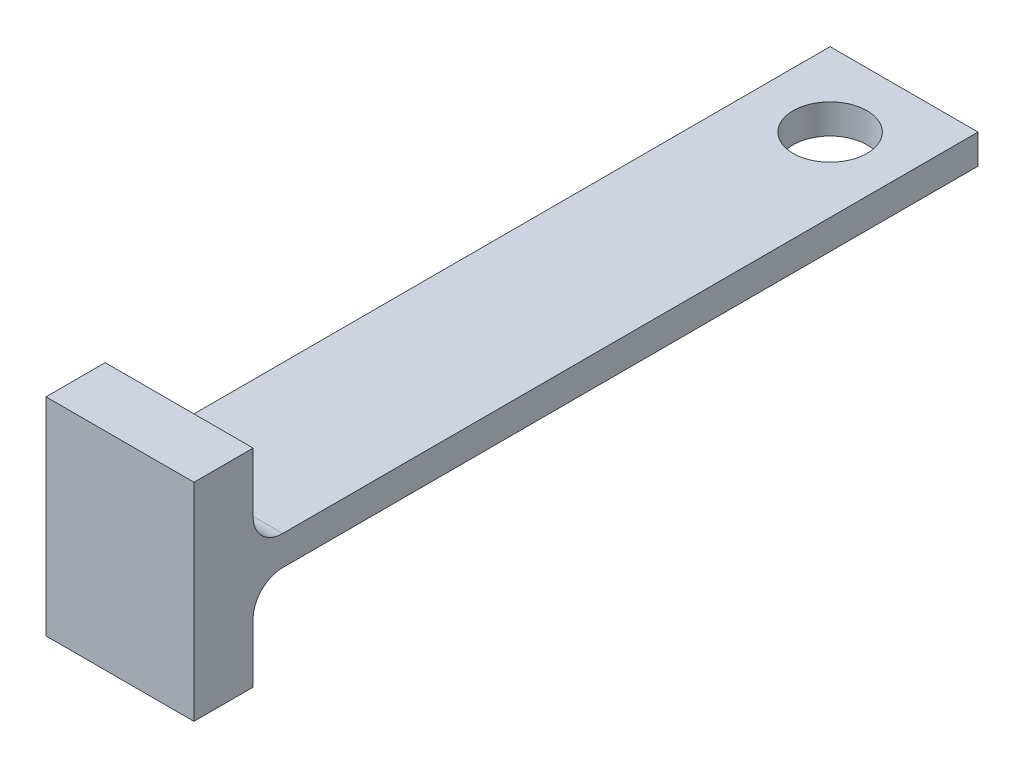
ISO-10303-21;
HEADER;
FILE_DESCRIPTION(('STEP AP214'),'2;1');
FILE_NAME('part.step','',(''),(''),'','','');
FILE_SCHEMA(('AUTOMOTIVE_DESIGN { 1 0 10303 214 1 1 1 1 }'));
ENDSEC;
DATA;
#1=APPLICATION_CONTEXT('core data for automotive mechanical design processes');
#2=APPLICATION_PROTOCOL_DEFINITION('international standard','automotive_design',2000,#1);
#3=PRODUCT_CONTEXT('',#1,'mechanical');
#4=PRODUCT('Part','Part','',(#3));
#5=PRODUCT_RELATED_PRODUCT_CATEGORY('part','',(#4));
#6=PRODUCT_DEFINITION_FORMATION('','',#4);
#7=PRODUCT_DEFINITION_CONTEXT('part definition',#1,'design');
#8=PRODUCT_DEFINITION('design','',#6,#7);
#9=PRODUCT_DEFINITION_SHAPE('','',#8);
#10=(LENGTH_UNIT() NAMED_UNIT(*) SI_UNIT(.MILLI.,.METRE.));
#11=(NAMED_UNIT(*) PLANE_ANGLE_UNIT() SI_UNIT($,.RADIAN.));
#12=(NAMED_UNIT(*) SI_UNIT($,.STERADIAN.) SOLID_ANGLE_UNIT());
#13=UNCERTAINTY_MEASURE_WITH_UNIT(LENGTH_MEASURE(1.E-05),#10,'distance_accuracy_value','');
#14=(GEOMETRIC_REPRESENTATION_CONTEXT(3) GLOBAL_UNCERTAINTY_ASSIGNED_CONTEXT((#13)) GLOBAL_UNIT_ASSIGNED_CONTEXT((#10,
#11,#12)) REPRESENTATION_CONTEXT('',''));
#15=CARTESIAN_POINT('',(0.,0.,0.));
#16=DIRECTION('',(0.,0.,1.));
#17=DIRECTION('',(1.,0.,0.));
#18=AXIS2_PLACEMENT_3D('',#15,#16,#17);
#19=CARTESIAN_POINT('',(0.,0.,0.));
#20=DIRECTION('',(0.,1.,0.));
#21=DIRECTION('',(0.,0.,1.));
#22=AXIS2_PLACEMENT_3D('',#19,#20,#21);
#23=PLANE('',#22);
#24=CARTESIAN_POINT('',(-25.,0.,-240.));
#25=DIRECTION('',(0.,1.,0.));
#26=DIRECTION('',(0.,0.,1.));
#27=AXIS2_PLACEMENT_3D('',#24,#25,#26);
#28=CIRCLE('',#27,12.5);
#29=CARTESIAN_POINT('',(-25.,0.,-227.5));
#30=VERTEX_POINT('',#29);
#31=EDGE_CURVE('E152',#30,#30,#28,.T.);
#32=ORIENTED_EDGE('',*,*,#31,.T.);
#33=EDGE_LOOP('',(#32));
#34=FACE_BOUND('',#33,.T.);
#35=DIRECTION('',(0.,0.,-1.));
#36=VECTOR('',#35,1.);
#37=CARTESIAN_POINT('',(0.,0.,0.));
#38=LINE('',#37,#36);
#39=CARTESIAN_POINT('',(0.,0.,-30.));
#40=VERTEX_POINT('',#39);
#41=CARTESIAN_POINT('',(0.,0.,-265.));
#42=VERTEX_POINT('',#41);
#43=EDGE_CURVE('E151',#40,#42,#38,.T.);
#44=ORIENTED_EDGE('',*,*,#43,.F.);
#45=DIRECTION('',(1.,0.,0.));
#46=VECTOR('',#45,1.);
#47=CARTESIAN_POINT('',(-50.,0.,-30.));
#48=LINE('',#47,#46);
#49=CARTESIAN_POINT('',(-50.,0.,-30.));
#50=VERTEX_POINT('',#49);
#51=EDGE_CURVE('E54',#40,#50,#48,.F.);
#52=ORIENTED_EDGE('',*,*,#51,.T.);
#53=DIRECTION('',(0.,0.,1.));
#54=VECTOR('',#53,1.);
#55=CARTESIAN_POINT('',(-50.,0.,0.));
#56=LINE('',#55,#54);
#57=CARTESIAN_POINT('',(-50.,0.,-265.));
#58=VERTEX_POINT('',#57);
#59=EDGE_CURVE('E164',#58,#50,#56,.T.);
#60=ORIENTED_EDGE('',*,*,#59,.F.);
#61=DIRECTION('',(-1.,0.,0.));
#62=VECTOR('',#61,1.);
#63=CARTESIAN_POINT('',(0.,0.,-265.));
#64=LINE('',#63,#62);
#65=EDGE_CURVE('E174',#42,#58,#64,.T.);
#66=ORIENTED_EDGE('',*,*,#65,.F.);
#67=EDGE_LOOP('',(#44,#52,#60,#66));
#68=FACE_BOUND('',#67,.T.);
#69=ADVANCED_FACE('F33',(#34,#68),#23,.F.);
#70=CARTESIAN_POINT('',(0.,10.,0.));
#71=DIRECTION('',(0.,1.,0.));
#72=DIRECTION('',(0.,0.,1.));
#73=AXIS2_PLACEMENT_3D('',#70,#71,#72);
#74=PLANE('',#73);
#75=DIRECTION('',(0.,0.,1.));
#76=VECTOR('',#75,1.);
#77=CARTESIAN_POINT('',(-50.,10.,0.));
#78=LINE('',#77,#76);
#79=CARTESIAN_POINT('',(-50.,10.,-265.));
#80=VERTEX_POINT('',#79);
#81=CARTESIAN_POINT('',(-50.,10.,-30.));
#82=VERTEX_POINT('',#81);
#83=EDGE_CURVE('E120',#80,#82,#78,.T.);
#84=ORIENTED_EDGE('',*,*,#83,.T.);
#85=DIRECTION('',(-1.,0.,0.));
#86=VECTOR('',#85,1.);
#87=CARTESIAN_POINT('',(0.,10.,-30.));
#88=LINE('',#87,#86);
#89=CARTESIAN_POINT('',(0.,10.,-30.));
#90=VERTEX_POINT('',#89);
#91=EDGE_CURVE('E167',#82,#90,#88,.F.);
#92=ORIENTED_EDGE('',*,*,#91,.T.);
#93=DIRECTION('',(0.,0.,-1.));
#94=VECTOR('',#93,1.);
#95=CARTESIAN_POINT('',(0.,10.,0.));
#96=LINE('',#95,#94);
#97=CARTESIAN_POINT('',(0.,10.,-265.));
#98=VERTEX_POINT('',#97);
#99=EDGE_CURVE('E161',#90,#98,#96,.T.);
#100=ORIENTED_EDGE('',*,*,#99,.T.);
#101=DIRECTION('',(-1.,0.,0.));
#102=VECTOR('',#101,1.);
#103=CARTESIAN_POINT('',(0.,10.,-265.));
#104=LINE('',#103,#102);
#105=EDGE_CURVE('E158',#98,#80,#104,.T.);
#106=ORIENTED_EDGE('',*,*,#105,.T.);
#107=EDGE_LOOP('',(#84,#92,#100,#106));
#108=FACE_BOUND('',#107,.T.);
#109=CARTESIAN_POINT('',(-25.,10.,-240.));
#110=DIRECTION('',(0.,1.,0.));
#111=DIRECTION('',(0.,0.,1.));
#112=AXIS2_PLACEMENT_3D('',#109,#110,#111);
#113=CIRCLE('',#112,12.5);
#114=CARTESIAN_POINT('',(-25.,10.,-227.5));
#115=VERTEX_POINT('',#114);
#116=EDGE_CURVE('E148',#115,#115,#113,.T.);
#117=ORIENTED_EDGE('',*,*,#116,.F.);
#118=EDGE_LOOP('',(#117));
#119=FACE_BOUND('',#118,.T.);
#120=ADVANCED_FACE('F214',(#108,#119),#74,.T.);
#121=CARTESIAN_POINT('',(0.,10.,0.));
#122=DIRECTION('',(-1.,0.,0.));
#123=DIRECTION('',(0.,0.,1.));
#124=AXIS2_PLACEMENT_3D('',#121,#122,#123);
#125=PLANE('',#124);
#126=DIRECTION('',(0.,-1.,0.));
#127=VECTOR('',#126,1.);
#128=CARTESIAN_POINT('',(0.,10.,0.));
#129=LINE('',#128,#127);
#130=CARTESIAN_POINT('',(0.,40.,0.));
#131=VERTEX_POINT('',#130);
#132=CARTESIAN_POINT('',(0.,-30.,0.));
#133=VERTEX_POINT('',#132);
#134=EDGE_CURVE('E108',#131,#133,#129,.T.);
#135=ORIENTED_EDGE('',*,*,#134,.T.);
#136=DIRECTION('',(0.,0.,1.));
#137=VECTOR('',#136,1.);
#138=CARTESIAN_POINT('',(0.,-30.,0.));
#139=LINE('',#138,#137);
#140=CARTESIAN_POINT('',(0.,-30.,-20.));
#141=VERTEX_POINT('',#140);
#142=EDGE_CURVE('E112',#141,#133,#139,.T.);
#143=ORIENTED_EDGE('',*,*,#142,.F.);
#144=DIRECTION('',(0.,1.,0.));
#145=VECTOR('',#144,1.);
#146=CARTESIAN_POINT('',(0.,-30.,-20.));
#147=LINE('',#146,#145);
#148=CARTESIAN_POINT('',(0.,-10.,-20.));
#149=VERTEX_POINT('',#148);
#150=EDGE_CURVE('E137',#141,#149,#147,.T.);
#151=ORIENTED_EDGE('',*,*,#150,.T.);
#152=CARTESIAN_POINT('',(0.,-10.,-30.));
#153=DIRECTION('',(-1.,0.,0.));
#154=DIRECTION('',(0.,0.,1.));
#155=AXIS2_PLACEMENT_3D('',#152,#153,#154);
#156=CIRCLE('',#155,10.);
#157=EDGE_CURVE('E41',#149,#40,#156,.T.);
#158=ORIENTED_EDGE('',*,*,#157,.T.);
#159=ORIENTED_EDGE('',*,*,#43,.T.);
#160=DIRECTION('',(0.,-1.,0.));
#161=VECTOR('',#160,1.);
#162=CARTESIAN_POINT('',(0.,10.,-265.));
#163=LINE('',#162,#161);
#164=EDGE_CURVE('E230',#98,#42,#163,.T.);
#165=ORIENTED_EDGE('',*,*,#164,.F.);
#166=ORIENTED_EDGE('',*,*,#99,.F.);
#167=CARTESIAN_POINT('',(0.,20.,-30.));
#168=DIRECTION('',(-1.,0.,0.));
#169=DIRECTION('',(0.,0.,1.));
#170=AXIS2_PLACEMENT_3D('',#167,#168,#169);
#171=CIRCLE('',#170,10.);
#172=CARTESIAN_POINT('',(0.,20.,-20.));
#173=VERTEX_POINT('',#172);
#174=EDGE_CURVE('E199',#90,#173,#171,.T.);
#175=ORIENTED_EDGE('',*,*,#174,.T.);
#176=DIRECTION('',(0.,-1.,0.));
#177=VECTOR('',#176,1.);
#178=CARTESIAN_POINT('',(0.,40.,-20.));
#179=LINE('',#178,#177);
#180=CARTESIAN_POINT('',(0.,40.,-20.));
#181=VERTEX_POINT('',#180);
#182=EDGE_CURVE('E155',#181,#173,#179,.T.);
#183=ORIENTED_EDGE('',*,*,#182,.F.);
#184=DIRECTION('',(0.,0.,-1.));
#185=VECTOR('',#184,1.);
#186=CARTESIAN_POINT('',(0.,40.,0.));
#187=LINE('',#186,#185);
#188=EDGE_CURVE('E115',#131,#181,#187,.T.);
#189=ORIENTED_EDGE('',*,*,#188,.F.);
#190=EDGE_LOOP('',(#135,#143,#151,#158,#159,#165,#166,#175,#183,#189));
#191=FACE_BOUND('',#190,.T.);
#192=ADVANCED_FACE('F110',(#191),#125,.F.);
#193=CARTESIAN_POINT('',(0.,10.,-265.));
#194=DIRECTION('',(0.,0.,1.));
#195=DIRECTION('',(1.,0.,0.));
#196=AXIS2_PLACEMENT_3D('',#193,#194,#195);
#197=PLANE('',#196);
#198=ORIENTED_EDGE('',*,*,#65,.T.);
#199=DIRECTION('',(0.,-1.,0.));
#200=VECTOR('',#199,1.);
#201=CARTESIAN_POINT('',(-50.,10.,-265.));
#202=LINE('',#201,#200);
#203=EDGE_CURVE('E233',#80,#58,#202,.T.);
#204=ORIENTED_EDGE('',*,*,#203,.F.);
#205=ORIENTED_EDGE('',*,*,#105,.F.);
#206=ORIENTED_EDGE('',*,*,#164,.T.);
#207=EDGE_LOOP('',(#198,#204,#205,#206));
#208=FACE_BOUND('',#207,.T.);
#209=ADVANCED_FACE('F236',(#208),#197,.F.);
#210=CARTESIAN_POINT('',(-50.,10.,0.));
#211=DIRECTION('',(1.,0.,0.));
#212=DIRECTION('',(0.,0.,-1.));
#213=AXIS2_PLACEMENT_3D('',#210,#211,#212);
#214=PLANE('',#213);
#215=ORIENTED_EDGE('',*,*,#59,.T.);
#216=CARTESIAN_POINT('',(-50.,-10.,-30.));
#217=DIRECTION('',(1.,0.,0.));
#218=DIRECTION('',(0.,0.,-1.));
#219=AXIS2_PLACEMENT_3D('',#216,#217,#218);
#220=CIRCLE('',#219,10.);
#221=CARTESIAN_POINT('',(-50.,-10.,-20.));
#222=VERTEX_POINT('',#221);
#223=EDGE_CURVE('E11',#50,#222,#220,.T.);
#224=ORIENTED_EDGE('',*,*,#223,.T.);
#225=DIRECTION('',(0.,1.,0.));
#226=VECTOR('',#225,1.);
#227=CARTESIAN_POINT('',(-50.,-30.,-20.));
#228=LINE('',#227,#226);
#229=CARTESIAN_POINT('',(-50.,-30.,-20.));
#230=VERTEX_POINT('',#229);
#231=EDGE_CURVE('E140',#230,#222,#228,.T.);
#232=ORIENTED_EDGE('',*,*,#231,.F.);
#233=DIRECTION('',(0.,0.,-1.));
#234=VECTOR('',#233,1.);
#235=CARTESIAN_POINT('',(-50.,-30.,0.));
#236=LINE('',#235,#234);
#237=CARTESIAN_POINT('',(-50.,-30.,0.));
#238=VERTEX_POINT('',#237);
#239=EDGE_CURVE('E127',#238,#230,#236,.T.);
#240=ORIENTED_EDGE('',*,*,#239,.F.);
#241=DIRECTION('',(0.,-1.,0.));
#242=VECTOR('',#241,1.);
#243=CARTESIAN_POINT('',(-50.,10.,0.));
#244=LINE('',#243,#242);
#245=CARTESIAN_POINT('',(-50.,40.,0.));
#246=VERTEX_POINT('',#245);
#247=EDGE_CURVE('E119',#246,#238,#244,.T.);
#248=ORIENTED_EDGE('',*,*,#247,.F.);
#249=DIRECTION('',(0.,0.,1.));
#250=VECTOR('',#249,1.);
#251=CARTESIAN_POINT('',(-50.,40.,0.));
#252=LINE('',#251,#250);
#253=CARTESIAN_POINT('',(-50.,40.,-20.));
#254=VERTEX_POINT('',#253);
#255=EDGE_CURVE('E142',#254,#246,#252,.T.);
#256=ORIENTED_EDGE('',*,*,#255,.F.);
#257=DIRECTION('',(0.,-1.,0.));
#258=VECTOR('',#257,1.);
#259=CARTESIAN_POINT('',(-50.,40.,-20.));
#260=LINE('',#259,#258);
#261=CARTESIAN_POINT('',(-50.,20.,-20.));
#262=VERTEX_POINT('',#261);
#263=EDGE_CURVE('E147',#254,#262,#260,.T.);
#264=ORIENTED_EDGE('',*,*,#263,.T.);
#265=CARTESIAN_POINT('',(-50.,20.,-30.));
#266=DIRECTION('',(1.,0.,0.));
#267=DIRECTION('',(0.,0.,-1.));
#268=AXIS2_PLACEMENT_3D('',#265,#266,#267);
#269=CIRCLE('',#268,10.);
#270=EDGE_CURVE('E200',#262,#82,#269,.T.);
#271=ORIENTED_EDGE('',*,*,#270,.T.);
#272=ORIENTED_EDGE('',*,*,#83,.F.);
#273=ORIENTED_EDGE('',*,*,#203,.T.);
#274=EDGE_LOOP('',(#215,#224,#232,#240,#248,#256,#264,#271,#272,#273));
#275=FACE_BOUND('',#274,.T.);
#276=ADVANCED_FACE('F205',(#275),#214,.F.);
#277=CARTESIAN_POINT('',(0.,10.,0.));
#278=DIRECTION('',(0.,0.,-1.));
#279=DIRECTION('',(-1.,0.,0.));
#280=AXIS2_PLACEMENT_3D('',#277,#278,#279);
#281=PLANE('',#280);
#282=ORIENTED_EDGE('',*,*,#247,.T.);
#283=DIRECTION('',(-1.,0.,0.));
#284=VECTOR('',#283,1.);
#285=CARTESIAN_POINT('',(0.,-30.,0.));
#286=LINE('',#285,#284);
#287=EDGE_CURVE('E123',#133,#238,#286,.T.);
#288=ORIENTED_EDGE('',*,*,#287,.F.);
#289=ORIENTED_EDGE('',*,*,#134,.F.);
#290=DIRECTION('',(1.,0.,0.));
#291=VECTOR('',#290,1.);
#292=CARTESIAN_POINT('',(0.,40.,0.));
#293=LINE('',#292,#291);
#294=EDGE_CURVE('E145',#246,#131,#293,.T.);
#295=ORIENTED_EDGE('',*,*,#294,.F.);
#296=EDGE_LOOP('',(#282,#288,#289,#295));
#297=FACE_BOUND('',#296,.T.);
#298=ADVANCED_FACE('F124',(#297),#281,.F.);
#299=CARTESIAN_POINT('',(-25.,10.,-240.));
#300=DIRECTION('',(0.,-1.,0.));
#301=DIRECTION('',(0.,0.,-1.));
#302=AXIS2_PLACEMENT_3D('',#299,#300,#301);
#303=CYLINDRICAL_SURFACE('',#302,12.5);
#304=ORIENTED_EDGE('',*,*,#116,.T.);
#305=EDGE_LOOP('',(#304));
#306=FACE_BOUND('',#305,.T.);
#307=ORIENTED_EDGE('',*,*,#31,.F.);
#308=EDGE_LOOP('',(#307));
#309=FACE_BOUND('',#308,.T.);
#310=ADVANCED_FACE('F255',(#306,#309),#303,.F.);
#311=CARTESIAN_POINT('',(0.,40.,-20.));
#312=DIRECTION('',(0.,0.,1.));
#313=DIRECTION('',(1.,0.,0.));
#314=AXIS2_PLACEMENT_3D('',#311,#312,#313);
#315=PLANE('',#314);
#316=ORIENTED_EDGE('',*,*,#182,.T.);
#317=DIRECTION('',(-1.,0.,0.));
#318=VECTOR('',#317,1.);
#319=CARTESIAN_POINT('',(0.,20.,-20.));
#320=LINE('',#319,#318);
#321=EDGE_CURVE('E165',#173,#262,#320,.T.);
#322=ORIENTED_EDGE('',*,*,#321,.T.);
#323=ORIENTED_EDGE('',*,*,#263,.F.);
#324=DIRECTION('',(-1.,0.,0.));
#325=VECTOR('',#324,1.);
#326=CARTESIAN_POINT('',(0.,40.,-20.));
#327=LINE('',#326,#325);
#328=EDGE_CURVE('E139',#181,#254,#327,.T.);
#329=ORIENTED_EDGE('',*,*,#328,.F.);
#330=EDGE_LOOP('',(#316,#322,#323,#329));
#331=FACE_BOUND('',#330,.T.);
#332=ADVANCED_FACE('F225',(#331),#315,.F.);
#333=CARTESIAN_POINT('',(0.,40.,0.));
#334=DIRECTION('',(0.,1.,0.));
#335=DIRECTION('',(0.,0.,1.));
#336=AXIS2_PLACEMENT_3D('',#333,#334,#335);
#337=PLANE('',#336);
#338=ORIENTED_EDGE('',*,*,#188,.T.);
#339=ORIENTED_EDGE('',*,*,#328,.T.);
#340=ORIENTED_EDGE('',*,*,#255,.T.);
#341=ORIENTED_EDGE('',*,*,#294,.T.);
#342=EDGE_LOOP('',(#338,#339,#340,#341));
#343=FACE_BOUND('',#342,.T.);
#344=ADVANCED_FACE('F263',(#343),#337,.T.);
#345=CARTESIAN_POINT('',(0.,-30.,-20.));
#346=DIRECTION('',(0.,0.,1.));
#347=DIRECTION('',(1.,0.,0.));
#348=AXIS2_PLACEMENT_3D('',#345,#346,#347);
#349=PLANE('',#348);
#350=ORIENTED_EDGE('',*,*,#231,.T.);
#351=DIRECTION('',(1.,0.,0.));
#352=VECTOR('',#351,1.);
#353=CARTESIAN_POINT('',(0.,-10.,-20.));
#354=LINE('',#353,#352);
#355=EDGE_CURVE('E169',#222,#149,#354,.T.);
#356=ORIENTED_EDGE('',*,*,#355,.T.);
#357=ORIENTED_EDGE('',*,*,#150,.F.);
#358=DIRECTION('',(1.,0.,0.));
#359=VECTOR('',#358,1.);
#360=CARTESIAN_POINT('',(0.,-30.,-20.));
#361=LINE('',#360,#359);
#362=EDGE_CURVE('E131',#230,#141,#361,.T.);
#363=ORIENTED_EDGE('',*,*,#362,.F.);
#364=EDGE_LOOP('',(#350,#356,#357,#363));
#365=FACE_BOUND('',#364,.T.);
#366=ADVANCED_FACE('F195',(#365),#349,.F.);
#367=CARTESIAN_POINT('',(0.,-30.,0.));
#368=DIRECTION('',(0.,1.,0.));
#369=DIRECTION('',(0.,0.,1.));
#370=AXIS2_PLACEMENT_3D('',#367,#368,#369);
#371=PLANE('',#370);
#372=ORIENTED_EDGE('',*,*,#142,.T.);
#373=ORIENTED_EDGE('',*,*,#287,.T.);
#374=ORIENTED_EDGE('',*,*,#239,.T.);
#375=ORIENTED_EDGE('',*,*,#362,.T.);
#376=EDGE_LOOP('',(#372,#373,#374,#375));
#377=FACE_BOUND('',#376,.T.);
#378=ADVANCED_FACE('F129',(#377),#371,.F.);
#379=CARTESIAN_POINT('',(0.,20.,-30.));
#380=DIRECTION('',(-1.,0.,0.));
#381=DIRECTION('',(0.,0.,1.));
#382=AXIS2_PLACEMENT_3D('',#379,#380,#381);
#383=CYLINDRICAL_SURFACE('',#382,10.);
#384=ORIENTED_EDGE('',*,*,#174,.F.);
#385=ORIENTED_EDGE('',*,*,#91,.F.);
#386=ORIENTED_EDGE('',*,*,#270,.F.);
#387=ORIENTED_EDGE('',*,*,#321,.F.);
#388=EDGE_LOOP('',(#384,#385,#386,#387));
#389=FACE_BOUND('',#388,.T.);
#390=ADVANCED_FACE('F221',(#389),#383,.F.);
#391=CARTESIAN_POINT('',(0.,-10.,-30.));
#392=DIRECTION('',(-1.,0.,0.));
#393=DIRECTION('',(0.,0.,1.));
#394=AXIS2_PLACEMENT_3D('',#391,#392,#393);
#395=CYLINDRICAL_SURFACE('',#394,10.);
#396=ORIENTED_EDGE('',*,*,#223,.F.);
#397=ORIENTED_EDGE('',*,*,#51,.F.);
#398=ORIENTED_EDGE('',*,*,#157,.F.);
#399=ORIENTED_EDGE('',*,*,#355,.F.);
#400=EDGE_LOOP('',(#396,#397,#398,#399));
#401=FACE_BOUND('',#400,.T.);
#402=ADVANCED_FACE('F35',(#401),#395,.F.);
#403=CLOSED_SHELL('',(#69,#120,#192,#209,#276,#298,#310,#332,#344,#366,#378,#390,#402));
#404=MANIFOLD_SOLID_BREP('B2',#403);
#405=ADVANCED_BREP_SHAPE_REPRESENTATION('',(#18,#404),#14);
#406=SHAPE_DEFINITION_REPRESENTATION(#9,#405);
ENDSEC;
END-ISO-10303-21;
